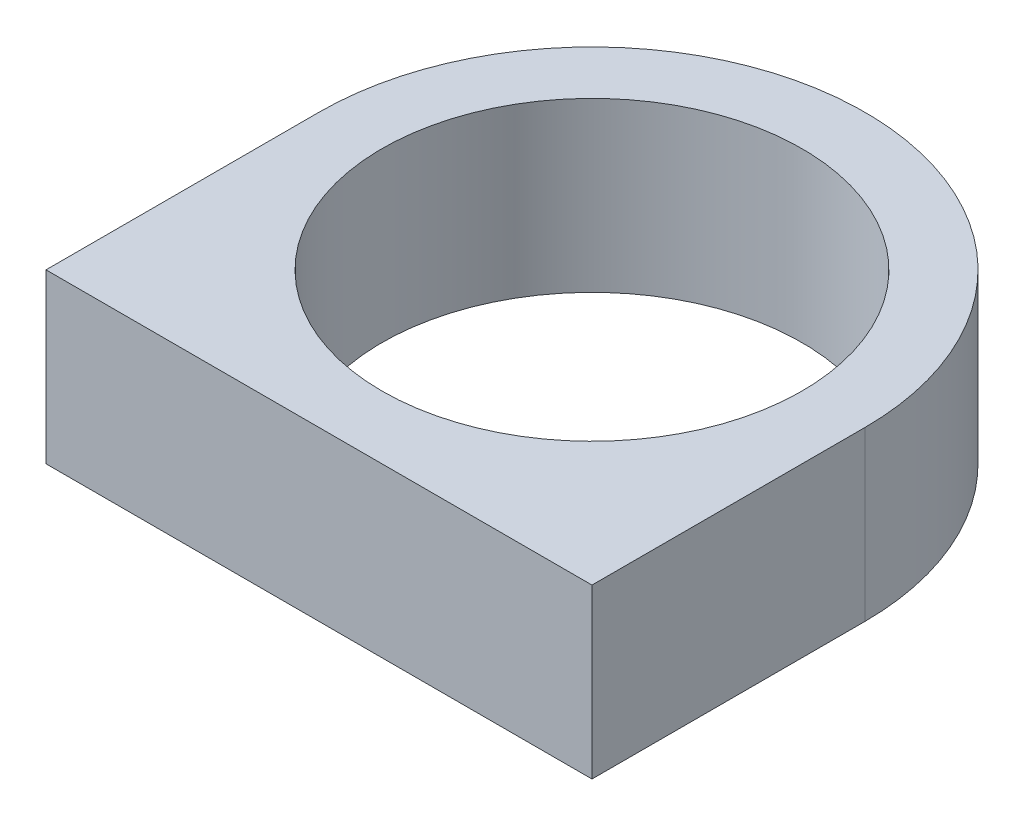
ISO-10303-21;
HEADER;
FILE_DESCRIPTION(('STEP AP214'),'2;1');
FILE_NAME('part.step','',(''),(''),'','','');
FILE_SCHEMA(('AUTOMOTIVE_DESIGN { 1 0 10303 214 1 1 1 1 }'));
ENDSEC;
DATA;
#1=APPLICATION_CONTEXT('core data for automotive mechanical design processes');
#2=APPLICATION_PROTOCOL_DEFINITION('international standard','automotive_design',2000,#1);
#3=PRODUCT_CONTEXT('',#1,'mechanical');
#4=PRODUCT('Part','Part','',(#3));
#5=PRODUCT_RELATED_PRODUCT_CATEGORY('part','',(#4));
#6=PRODUCT_DEFINITION_FORMATION('','',#4);
#7=PRODUCT_DEFINITION_CONTEXT('part definition',#1,'design');
#8=PRODUCT_DEFINITION('design','',#6,#7);
#9=PRODUCT_DEFINITION_SHAPE('','',#8);
#10=(LENGTH_UNIT() NAMED_UNIT(*) SI_UNIT(.MILLI.,.METRE.));
#11=(NAMED_UNIT(*) PLANE_ANGLE_UNIT() SI_UNIT($,.RADIAN.));
#12=(NAMED_UNIT(*) SI_UNIT($,.STERADIAN.) SOLID_ANGLE_UNIT());
#13=UNCERTAINTY_MEASURE_WITH_UNIT(LENGTH_MEASURE(1.E-05),#10,'distance_accuracy_value','');
#14=(GEOMETRIC_REPRESENTATION_CONTEXT(3) GLOBAL_UNCERTAINTY_ASSIGNED_CONTEXT((#13)) GLOBAL_UNIT_ASSIGNED_CONTEXT((#10,
#11,#12)) REPRESENTATION_CONTEXT('',''));
#15=CARTESIAN_POINT('',(0.,0.,0.));
#16=DIRECTION('',(0.,0.,1.));
#17=DIRECTION('',(1.,0.,0.));
#18=AXIS2_PLACEMENT_3D('',#15,#16,#17);
#19=CARTESIAN_POINT('',(0.,2.,0.));
#20=DIRECTION('',(0.,1.,0.));
#21=DIRECTION('',(0.,0.,1.));
#22=AXIS2_PLACEMENT_3D('',#19,#20,#21);
#23=PLANE('',#22);
#24=CARTESIAN_POINT('',(0.,2.,0.));
#25=DIRECTION('',(0.,1.,0.));
#26=DIRECTION('',(0.,0.,1.));
#27=AXIS2_PLACEMENT_3D('',#24,#25,#26);
#28=CIRCLE('',#27,3.25);
#29=CARTESIAN_POINT('',(3.25,2.,0.));
#30=VERTEX_POINT('',#29);
#31=CARTESIAN_POINT('',(-3.25,2.,0.));
#32=VERTEX_POINT('',#31);
#33=EDGE_CURVE('E88',#30,#32,#28,.T.);
#34=ORIENTED_EDGE('',*,*,#33,.T.);
#35=DIRECTION('',(0.,0.,1.));
#36=VECTOR('',#35,1.);
#37=CARTESIAN_POINT('',(-3.25,2.,0.));
#38=LINE('',#37,#36);
#39=CARTESIAN_POINT('',(-3.25,2.,3.25));
#40=VERTEX_POINT('',#39);
#41=EDGE_CURVE('E83',#32,#40,#38,.T.);
#42=ORIENTED_EDGE('',*,*,#41,.T.);
#43=DIRECTION('',(1.,0.,0.));
#44=VECTOR('',#43,1.);
#45=CARTESIAN_POINT('',(-3.25,2.,3.25));
#46=LINE('',#45,#44);
#47=CARTESIAN_POINT('',(3.25,2.,3.25));
#48=VERTEX_POINT('',#47);
#49=EDGE_CURVE('E86',#40,#48,#46,.T.);
#50=ORIENTED_EDGE('',*,*,#49,.T.);
#51=DIRECTION('',(0.,0.,-1.));
#52=VECTOR('',#51,1.);
#53=CARTESIAN_POINT('',(3.25,2.,3.25));
#54=LINE('',#53,#52);
#55=EDGE_CURVE('E53',#48,#30,#54,.T.);
#56=ORIENTED_EDGE('',*,*,#55,.T.);
#57=EDGE_LOOP('',(#34,#42,#50,#56));
#58=FACE_BOUND('',#57,.T.);
#59=CARTESIAN_POINT('',(0.,2.,0.));
#60=DIRECTION('',(0.,1.,0.));
#61=DIRECTION('',(0.,0.,1.));
#62=AXIS2_PLACEMENT_3D('',#59,#60,#61);
#63=CIRCLE('',#62,2.5);
#64=CARTESIAN_POINT('',(0.,2.,2.5));
#65=VERTEX_POINT('',#64);
#66=EDGE_CURVE('E103',#65,#65,#63,.T.);
#67=ORIENTED_EDGE('',*,*,#66,.F.);
#68=EDGE_LOOP('',(#67));
#69=FACE_BOUND('',#68,.T.);
#70=ADVANCED_FACE('F36',(#58,#69),#23,.T.);
#71=CARTESIAN_POINT('',(0.,0.,0.));
#72=DIRECTION('',(0.,1.,0.));
#73=DIRECTION('',(0.,0.,1.));
#74=AXIS2_PLACEMENT_3D('',#71,#72,#73);
#75=PLANE('',#74);
#76=CARTESIAN_POINT('',(0.,0.,0.));
#77=DIRECTION('',(0.,1.,0.));
#78=DIRECTION('',(0.,0.,1.));
#79=AXIS2_PLACEMENT_3D('',#76,#77,#78);
#80=CIRCLE('',#79,3.25);
#81=CARTESIAN_POINT('',(3.25,0.,0.));
#82=VERTEX_POINT('',#81);
#83=CARTESIAN_POINT('',(-3.25,0.,0.));
#84=VERTEX_POINT('',#83);
#85=EDGE_CURVE('E100',#82,#84,#80,.T.);
#86=ORIENTED_EDGE('',*,*,#85,.F.);
#87=DIRECTION('',(0.,0.,-1.));
#88=VECTOR('',#87,1.);
#89=CARTESIAN_POINT('',(3.25,0.,3.25));
#90=LINE('',#89,#88);
#91=CARTESIAN_POINT('',(3.25,0.,3.25));
#92=VERTEX_POINT('',#91);
#93=EDGE_CURVE('E76',#92,#82,#90,.T.);
#94=ORIENTED_EDGE('',*,*,#93,.F.);
#95=DIRECTION('',(1.,0.,0.));
#96=VECTOR('',#95,1.);
#97=CARTESIAN_POINT('',(-3.25,0.,3.25));
#98=LINE('',#97,#96);
#99=CARTESIAN_POINT('',(-3.25,0.,3.25));
#100=VERTEX_POINT('',#99);
#101=EDGE_CURVE('E70',#100,#92,#98,.T.);
#102=ORIENTED_EDGE('',*,*,#101,.F.);
#103=DIRECTION('',(0.,0.,1.));
#104=VECTOR('',#103,1.);
#105=CARTESIAN_POINT('',(-3.25,0.,0.));
#106=LINE('',#105,#104);
#107=EDGE_CURVE('E92',#84,#100,#106,.T.);
#108=ORIENTED_EDGE('',*,*,#107,.F.);
#109=EDGE_LOOP('',(#86,#94,#102,#108));
#110=FACE_BOUND('',#109,.T.);
#111=CARTESIAN_POINT('',(0.,0.,0.));
#112=DIRECTION('',(0.,1.,0.));
#113=DIRECTION('',(0.,0.,1.));
#114=AXIS2_PLACEMENT_3D('',#111,#112,#113);
#115=CIRCLE('',#114,2.5);
#116=CARTESIAN_POINT('',(0.,0.,2.5));
#117=VERTEX_POINT('',#116);
#118=EDGE_CURVE('E115',#117,#117,#115,.T.);
#119=ORIENTED_EDGE('',*,*,#118,.T.);
#120=EDGE_LOOP('',(#119));
#121=FACE_BOUND('',#120,.T.);
#122=ADVANCED_FACE('F111',(#110,#121),#75,.F.);
#123=CARTESIAN_POINT('',(0.,2.,0.));
#124=DIRECTION('',(0.,-1.,0.));
#125=DIRECTION('',(0.,0.,-1.));
#126=AXIS2_PLACEMENT_3D('',#123,#124,#125);
#127=CYLINDRICAL_SURFACE('',#126,3.25);
#128=ORIENTED_EDGE('',*,*,#85,.T.);
#129=DIRECTION('',(0.,-1.,0.));
#130=VECTOR('',#129,1.);
#131=CARTESIAN_POINT('',(-3.25,2.,0.));
#132=LINE('',#131,#130);
#133=EDGE_CURVE('E11',#32,#84,#132,.T.);
#134=ORIENTED_EDGE('',*,*,#133,.F.);
#135=ORIENTED_EDGE('',*,*,#33,.F.);
#136=DIRECTION('',(0.,-1.,0.));
#137=VECTOR('',#136,1.);
#138=CARTESIAN_POINT('',(3.25,2.,0.));
#139=LINE('',#138,#137);
#140=EDGE_CURVE('E96',#30,#82,#139,.T.);
#141=ORIENTED_EDGE('',*,*,#140,.T.);
#142=EDGE_LOOP('',(#128,#134,#135,#141));
#143=FACE_BOUND('',#142,.T.);
#144=ADVANCED_FACE('F38',(#143),#127,.T.);
#145=CARTESIAN_POINT('',(-3.25,2.,0.));
#146=DIRECTION('',(1.,0.,0.));
#147=DIRECTION('',(0.,0.,-1.));
#148=AXIS2_PLACEMENT_3D('',#145,#146,#147);
#149=PLANE('',#148);
#150=ORIENTED_EDGE('',*,*,#107,.T.);
#151=DIRECTION('',(0.,-1.,0.));
#152=VECTOR('',#151,1.);
#153=CARTESIAN_POINT('',(-3.25,2.,3.25));
#154=LINE('',#153,#152);
#155=EDGE_CURVE('E45',#40,#100,#154,.T.);
#156=ORIENTED_EDGE('',*,*,#155,.F.);
#157=ORIENTED_EDGE('',*,*,#41,.F.);
#158=ORIENTED_EDGE('',*,*,#133,.T.);
#159=EDGE_LOOP('',(#150,#156,#157,#158));
#160=FACE_BOUND('',#159,.T.);
#161=ADVANCED_FACE('F91',(#160),#149,.F.);
#162=CARTESIAN_POINT('',(-3.25,2.,3.25));
#163=DIRECTION('',(0.,0.,-1.));
#164=DIRECTION('',(-1.,0.,0.));
#165=AXIS2_PLACEMENT_3D('',#162,#163,#164);
#166=PLANE('',#165);
#167=ORIENTED_EDGE('',*,*,#101,.T.);
#168=DIRECTION('',(0.,-1.,0.));
#169=VECTOR('',#168,1.);
#170=CARTESIAN_POINT('',(3.25,2.,3.25));
#171=LINE('',#170,#169);
#172=EDGE_CURVE('E93',#48,#92,#171,.T.);
#173=ORIENTED_EDGE('',*,*,#172,.F.);
#174=ORIENTED_EDGE('',*,*,#49,.F.);
#175=ORIENTED_EDGE('',*,*,#155,.T.);
#176=EDGE_LOOP('',(#167,#173,#174,#175));
#177=FACE_BOUND('',#176,.T.);
#178=ADVANCED_FACE('F94',(#177),#166,.F.);
#179=CARTESIAN_POINT('',(3.25,2.,3.25));
#180=DIRECTION('',(-1.,0.,0.));
#181=DIRECTION('',(0.,0.,1.));
#182=AXIS2_PLACEMENT_3D('',#179,#180,#181);
#183=PLANE('',#182);
#184=ORIENTED_EDGE('',*,*,#93,.T.);
#185=ORIENTED_EDGE('',*,*,#140,.F.);
#186=ORIENTED_EDGE('',*,*,#55,.F.);
#187=ORIENTED_EDGE('',*,*,#172,.T.);
#188=EDGE_LOOP('',(#184,#185,#186,#187));
#189=FACE_BOUND('',#188,.T.);
#190=ADVANCED_FACE('F108',(#189),#183,.F.);
#191=CARTESIAN_POINT('',(0.,2.,0.));
#192=DIRECTION('',(0.,-1.,0.));
#193=DIRECTION('',(0.,0.,-1.));
#194=AXIS2_PLACEMENT_3D('',#191,#192,#193);
#195=CYLINDRICAL_SURFACE('',#194,2.5);
#196=ORIENTED_EDGE('',*,*,#66,.T.);
#197=EDGE_LOOP('',(#196));
#198=FACE_BOUND('',#197,.T.);
#199=ORIENTED_EDGE('',*,*,#118,.F.);
#200=EDGE_LOOP('',(#199));
#201=FACE_BOUND('',#200,.T.);
#202=ADVANCED_FACE('F121',(#198,#201),#195,.F.);
#203=CLOSED_SHELL('',(#70,#122,#144,#161,#178,#190,#202));
#204=MANIFOLD_SOLID_BREP('B2',#203);
#205=ADVANCED_BREP_SHAPE_REPRESENTATION('',(#18,#204),#14);
#206=SHAPE_DEFINITION_REPRESENTATION(#9,#205);
ENDSEC;
END-ISO-10303-21;
